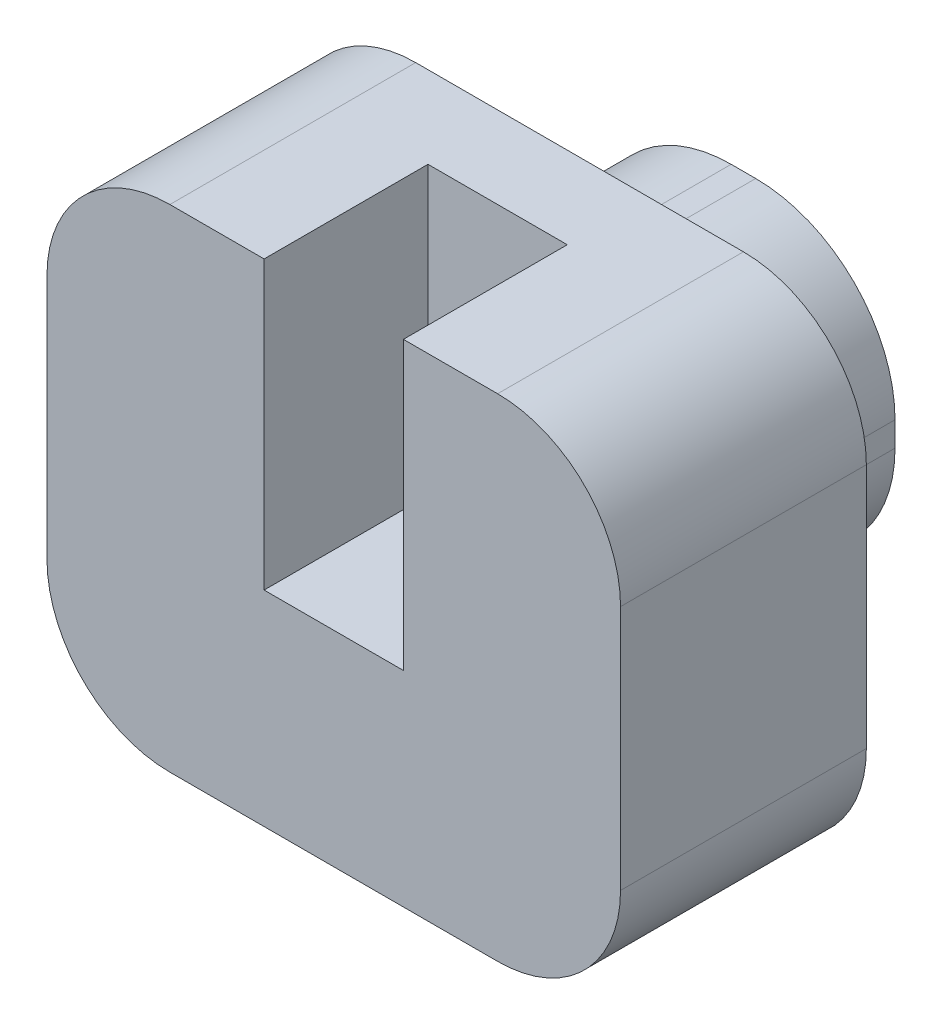
ISO-10303-21;
HEADER;
FILE_DESCRIPTION(('STEP AP214'),'2;1');
FILE_NAME('part.step','',(''),(''),'','','');
FILE_SCHEMA(('AUTOMOTIVE_DESIGN { 1 0 10303 214 1 1 1 1 }'));
ENDSEC;
DATA;
#1=APPLICATION_CONTEXT('core data for automotive mechanical design processes');
#2=APPLICATION_PROTOCOL_DEFINITION('international standard','automotive_design',2000,#1);
#3=PRODUCT_CONTEXT('',#1,'mechanical');
#4=PRODUCT('Part','Part','',(#3));
#5=PRODUCT_RELATED_PRODUCT_CATEGORY('part','',(#4));
#6=PRODUCT_DEFINITION_FORMATION('','',#4);
#7=PRODUCT_DEFINITION_CONTEXT('part definition',#1,'design');
#8=PRODUCT_DEFINITION('design','',#6,#7);
#9=PRODUCT_DEFINITION_SHAPE('','',#8);
#10=(LENGTH_UNIT() NAMED_UNIT(*) SI_UNIT(.MILLI.,.METRE.));
#11=(NAMED_UNIT(*) PLANE_ANGLE_UNIT() SI_UNIT($,.RADIAN.));
#12=(NAMED_UNIT(*) SI_UNIT($,.STERADIAN.) SOLID_ANGLE_UNIT());
#13=UNCERTAINTY_MEASURE_WITH_UNIT(LENGTH_MEASURE(1.E-05),#10,'distance_accuracy_value','');
#14=(GEOMETRIC_REPRESENTATION_CONTEXT(3) GLOBAL_UNCERTAINTY_ASSIGNED_CONTEXT((#13)) GLOBAL_UNIT_ASSIGNED_CONTEXT((#10,
#11,#12)) REPRESENTATION_CONTEXT('',''));
#15=CARTESIAN_POINT('',(0.,0.,0.));
#16=DIRECTION('',(0.,0.,1.));
#17=DIRECTION('',(1.,0.,0.));
#18=AXIS2_PLACEMENT_3D('',#15,#16,#17);
#19=CARTESIAN_POINT('',(-0.15,-0.15,2.));
#20=DIRECTION('',(0.,0.,-1.));
#21=DIRECTION('',(-1.,0.,0.));
#22=AXIS2_PLACEMENT_3D('',#19,#20,#21);
#23=CYLINDRICAL_SURFACE('',#22,1.7);
#24=CARTESIAN_POINT('',(-0.15,-0.15,0.));
#25=DIRECTION('',(0.,0.,1.));
#26=DIRECTION('',(1.,0.,0.));
#27=AXIS2_PLACEMENT_3D('',#24,#25,#26);
#28=CIRCLE('',#27,1.7);
#29=CARTESIAN_POINT('',(-1.85,-0.15,0.));
#30=VERTEX_POINT('',#29);
#31=CARTESIAN_POINT('',(-0.15,-1.85,0.));
#32=VERTEX_POINT('',#31);
#33=EDGE_CURVE('E151',#30,#32,#28,.T.);
#34=ORIENTED_EDGE('',*,*,#33,.T.);
#35=DIRECTION('',(0.,0.,-1.));
#36=VECTOR('',#35,1.);
#37=CARTESIAN_POINT('',(-0.15,-1.85,2.));
#38=LINE('',#37,#36);
#39=CARTESIAN_POINT('',(-0.15,-1.85,2.));
#40=VERTEX_POINT('',#39);
#41=EDGE_CURVE('E11',#40,#32,#38,.T.);
#42=ORIENTED_EDGE('',*,*,#41,.F.);
#43=CARTESIAN_POINT('',(-0.15,-0.15,2.));
#44=DIRECTION('',(0.,0.,1.));
#45=DIRECTION('',(1.,0.,0.));
#46=AXIS2_PLACEMENT_3D('',#43,#44,#45);
#47=CIRCLE('',#46,1.7);
#48=CARTESIAN_POINT('',(-1.85,-0.15,2.));
#49=VERTEX_POINT('',#48);
#50=EDGE_CURVE('E167',#49,#40,#47,.T.);
#51=ORIENTED_EDGE('',*,*,#50,.F.);
#52=DIRECTION('',(0.,0.,-1.));
#53=VECTOR('',#52,1.);
#54=CARTESIAN_POINT('',(-1.85,-0.15,2.));
#55=LINE('',#54,#53);
#56=EDGE_CURVE('E150',#49,#30,#55,.T.);
#57=ORIENTED_EDGE('',*,*,#56,.T.);
#58=EDGE_LOOP('',(#34,#42,#51,#57));
#59=FACE_BOUND('',#58,.T.);
#60=ADVANCED_FACE('F36',(#59),#23,.T.);
#61=CARTESIAN_POINT('',(-0.15,-1.85,2.));
#62=DIRECTION('',(0.,1.,0.));
#63=DIRECTION('',(0.,0.,1.));
#64=AXIS2_PLACEMENT_3D('',#61,#62,#63);
#65=PLANE('',#64);
#66=DIRECTION('',(1.,0.,0.));
#67=VECTOR('',#66,1.);
#68=CARTESIAN_POINT('',(-0.15,-1.85,0.));
#69=LINE('',#68,#67);
#70=CARTESIAN_POINT('',(0.150000000000001,-1.85,0.));
#71=VERTEX_POINT('',#70);
#72=EDGE_CURVE('E154',#32,#71,#69,.T.);
#73=ORIENTED_EDGE('',*,*,#72,.T.);
#74=DIRECTION('',(0.,0.,-1.));
#75=VECTOR('',#74,1.);
#76=CARTESIAN_POINT('',(0.150000000000001,-1.85,2.));
#77=LINE('',#76,#75);
#78=CARTESIAN_POINT('',(0.150000000000001,-1.85,2.));
#79=VERTEX_POINT('',#78);
#80=EDGE_CURVE('E43',#79,#71,#77,.T.);
#81=ORIENTED_EDGE('',*,*,#80,.F.);
#82=DIRECTION('',(1.,0.,0.));
#83=VECTOR('',#82,1.);
#84=CARTESIAN_POINT('',(-0.15,-1.85,2.));
#85=LINE('',#84,#83);
#86=EDGE_CURVE('E100',#40,#79,#85,.T.);
#87=ORIENTED_EDGE('',*,*,#86,.F.);
#88=ORIENTED_EDGE('',*,*,#41,.T.);
#89=EDGE_LOOP('',(#73,#81,#87,#88));
#90=FACE_BOUND('',#89,.T.);
#91=ADVANCED_FACE('F404',(#90),#65,.F.);
#92=CARTESIAN_POINT('',(0.15,-0.15,2.));
#93=DIRECTION('',(0.,0.,-1.));
#94=DIRECTION('',(-1.,0.,0.));
#95=AXIS2_PLACEMENT_3D('',#92,#93,#94);
#96=CYLINDRICAL_SURFACE('',#95,1.7);
#97=CARTESIAN_POINT('',(0.15,-0.15,0.));
#98=DIRECTION('',(0.,0.,1.));
#99=DIRECTION('',(-1.,0.,0.));
#100=AXIS2_PLACEMENT_3D('',#97,#98,#99);
#101=CIRCLE('',#100,1.7);
#102=CARTESIAN_POINT('',(1.85,-0.15,0.));
#103=VERTEX_POINT('',#102);
#104=EDGE_CURVE('E157',#71,#103,#101,.T.);
#105=ORIENTED_EDGE('',*,*,#104,.T.);
#106=DIRECTION('',(0.,0.,-1.));
#107=VECTOR('',#106,1.);
#108=CARTESIAN_POINT('',(1.85,-0.15,2.));
#109=LINE('',#108,#107);
#110=CARTESIAN_POINT('',(1.85,-0.15,2.));
#111=VERTEX_POINT('',#110);
#112=EDGE_CURVE('E172',#111,#103,#109,.T.);
#113=ORIENTED_EDGE('',*,*,#112,.F.);
#114=CARTESIAN_POINT('',(0.15,-0.15,2.));
#115=DIRECTION('',(0.,0.,1.));
#116=DIRECTION('',(-1.,0.,0.));
#117=AXIS2_PLACEMENT_3D('',#114,#115,#116);
#118=CIRCLE('',#117,1.7);
#119=EDGE_CURVE('E143',#79,#111,#118,.T.);
#120=ORIENTED_EDGE('',*,*,#119,.F.);
#121=ORIENTED_EDGE('',*,*,#80,.T.);
#122=EDGE_LOOP('',(#105,#113,#120,#121));
#123=FACE_BOUND('',#122,.T.);
#124=ADVANCED_FACE('F178',(#123),#96,.T.);
#125=CARTESIAN_POINT('',(1.85,-0.15,2.));
#126=DIRECTION('',(-1.,0.,0.));
#127=DIRECTION('',(0.,0.,1.));
#128=AXIS2_PLACEMENT_3D('',#125,#126,#127);
#129=PLANE('',#128);
#130=DIRECTION('',(0.,1.,0.));
#131=VECTOR('',#130,1.);
#132=CARTESIAN_POINT('',(1.85,-0.15,0.));
#133=LINE('',#132,#131);
#134=CARTESIAN_POINT('',(1.85,0.150000000000001,0.));
#135=VERTEX_POINT('',#134);
#136=EDGE_CURVE('E159',#103,#135,#133,.T.);
#137=ORIENTED_EDGE('',*,*,#136,.T.);
#138=DIRECTION('',(0.,0.,-1.));
#139=VECTOR('',#138,1.);
#140=CARTESIAN_POINT('',(1.85,0.150000000000001,2.));
#141=LINE('',#140,#139);
#142=CARTESIAN_POINT('',(1.85,0.150000000000001,2.));
#143=VERTEX_POINT('',#142);
#144=EDGE_CURVE('E126',#143,#135,#141,.T.);
#145=ORIENTED_EDGE('',*,*,#144,.F.);
#146=DIRECTION('',(0.,1.,0.));
#147=VECTOR('',#146,1.);
#148=CARTESIAN_POINT('',(1.85,-0.15,2.));
#149=LINE('',#148,#147);
#150=EDGE_CURVE('E141',#111,#143,#149,.T.);
#151=ORIENTED_EDGE('',*,*,#150,.F.);
#152=ORIENTED_EDGE('',*,*,#112,.T.);
#153=EDGE_LOOP('',(#137,#145,#151,#152));
#154=FACE_BOUND('',#153,.T.);
#155=ADVANCED_FACE('F184',(#154),#129,.F.);
#156=CARTESIAN_POINT('',(0.15,0.150000000000001,2.));
#157=DIRECTION('',(0.,0.,-1.));
#158=DIRECTION('',(-1.,0.,0.));
#159=AXIS2_PLACEMENT_3D('',#156,#157,#158);
#160=CYLINDRICAL_SURFACE('',#159,1.7);
#161=CARTESIAN_POINT('',(0.15,0.150000000000001,0.));
#162=DIRECTION('',(0.,0.,1.));
#163=DIRECTION('',(1.,0.,0.));
#164=AXIS2_PLACEMENT_3D('',#161,#162,#163);
#165=CIRCLE('',#164,1.7);
#166=CARTESIAN_POINT('',(0.15,1.85,0.));
#167=VERTEX_POINT('',#166);
#168=EDGE_CURVE('E123',#135,#167,#165,.T.);
#169=ORIENTED_EDGE('',*,*,#168,.T.);
#170=DIRECTION('',(0.,0.,-1.));
#171=VECTOR('',#170,1.);
#172=CARTESIAN_POINT('',(0.15,1.85,2.));
#173=LINE('',#172,#171);
#174=CARTESIAN_POINT('',(0.15,1.85,2.));
#175=VERTEX_POINT('',#174);
#176=EDGE_CURVE('E115',#175,#167,#173,.T.);
#177=ORIENTED_EDGE('',*,*,#176,.F.);
#178=CARTESIAN_POINT('',(0.15,0.150000000000001,2.));
#179=DIRECTION('',(0.,0.,1.));
#180=DIRECTION('',(1.,0.,0.));
#181=AXIS2_PLACEMENT_3D('',#178,#179,#180);
#182=CIRCLE('',#181,1.7);
#183=EDGE_CURVE('E120',#143,#175,#182,.T.);
#184=ORIENTED_EDGE('',*,*,#183,.F.);
#185=ORIENTED_EDGE('',*,*,#144,.T.);
#186=EDGE_LOOP('',(#169,#177,#184,#185));
#187=FACE_BOUND('',#186,.T.);
#188=ADVANCED_FACE('F117',(#187),#160,.T.);
#189=CARTESIAN_POINT('',(-0.15,1.85,2.));
#190=DIRECTION('',(0.,-1.,0.));
#191=DIRECTION('',(0.,0.,-1.));
#192=AXIS2_PLACEMENT_3D('',#189,#190,#191);
#193=PLANE('',#192);
#194=DIRECTION('',(-1.,0.,0.));
#195=VECTOR('',#194,1.);
#196=CARTESIAN_POINT('',(-0.15,1.85,0.));
#197=LINE('',#196,#195);
#198=CARTESIAN_POINT('',(-0.15,1.85,0.));
#199=VERTEX_POINT('',#198);
#200=EDGE_CURVE('E162',#167,#199,#197,.T.);
#201=ORIENTED_EDGE('',*,*,#200,.T.);
#202=DIRECTION('',(0.,0.,-1.));
#203=VECTOR('',#202,1.);
#204=CARTESIAN_POINT('',(-0.15,1.85,2.));
#205=LINE('',#204,#203);
#206=CARTESIAN_POINT('',(-0.15,1.85,2.));
#207=VERTEX_POINT('',#206);
#208=EDGE_CURVE('E127',#207,#199,#205,.T.);
#209=ORIENTED_EDGE('',*,*,#208,.F.);
#210=DIRECTION('',(-1.,0.,0.));
#211=VECTOR('',#210,1.);
#212=CARTESIAN_POINT('',(-0.15,1.85,2.));
#213=LINE('',#212,#211);
#214=EDGE_CURVE('E130',#175,#207,#213,.T.);
#215=ORIENTED_EDGE('',*,*,#214,.F.);
#216=ORIENTED_EDGE('',*,*,#176,.T.);
#217=EDGE_LOOP('',(#201,#209,#215,#216));
#218=FACE_BOUND('',#217,.T.);
#219=ADVANCED_FACE('F131',(#218),#193,.F.);
#220=CARTESIAN_POINT('',(-0.15,0.150000000000001,2.));
#221=DIRECTION('',(0.,0.,-1.));
#222=DIRECTION('',(-1.,0.,0.));
#223=AXIS2_PLACEMENT_3D('',#220,#221,#222);
#224=CYLINDRICAL_SURFACE('',#223,1.7);
#225=CARTESIAN_POINT('',(-0.15,0.150000000000001,0.));
#226=DIRECTION('',(0.,0.,1.));
#227=DIRECTION('',(1.,0.,0.));
#228=AXIS2_PLACEMENT_3D('',#225,#226,#227);
#229=CIRCLE('',#228,1.7);
#230=CARTESIAN_POINT('',(-1.85,0.150000000000001,0.));
#231=VERTEX_POINT('',#230);
#232=EDGE_CURVE('E164',#199,#231,#229,.T.);
#233=ORIENTED_EDGE('',*,*,#232,.T.);
#234=DIRECTION('',(0.,0.,-1.));
#235=VECTOR('',#234,1.);
#236=CARTESIAN_POINT('',(-1.85,0.150000000000001,2.));
#237=LINE('',#236,#235);
#238=CARTESIAN_POINT('',(-1.85,0.150000000000001,2.));
#239=VERTEX_POINT('',#238);
#240=EDGE_CURVE('E59',#239,#231,#237,.T.);
#241=ORIENTED_EDGE('',*,*,#240,.F.);
#242=CARTESIAN_POINT('',(-0.15,0.150000000000001,2.));
#243=DIRECTION('',(0.,0.,1.));
#244=DIRECTION('',(1.,0.,0.));
#245=AXIS2_PLACEMENT_3D('',#242,#243,#244);
#246=CIRCLE('',#245,1.7);
#247=EDGE_CURVE('E135',#207,#239,#246,.T.);
#248=ORIENTED_EDGE('',*,*,#247,.F.);
#249=ORIENTED_EDGE('',*,*,#208,.T.);
#250=EDGE_LOOP('',(#233,#241,#248,#249));
#251=FACE_BOUND('',#250,.T.);
#252=ADVANCED_FACE('F411',(#251),#224,.T.);
#253=CARTESIAN_POINT('',(-1.85,-0.15,2.));
#254=DIRECTION('',(1.,0.,0.));
#255=DIRECTION('',(0.,0.,-1.));
#256=AXIS2_PLACEMENT_3D('',#253,#254,#255);
#257=PLANE('',#256);
#258=DIRECTION('',(0.,-1.,0.));
#259=VECTOR('',#258,1.);
#260=CARTESIAN_POINT('',(-1.85,-0.15,0.));
#261=LINE('',#260,#259);
#262=EDGE_CURVE('E92',#231,#30,#261,.T.);
#263=ORIENTED_EDGE('',*,*,#262,.T.);
#264=ORIENTED_EDGE('',*,*,#56,.F.);
#265=DIRECTION('',(0.,-1.,0.));
#266=VECTOR('',#265,1.);
#267=CARTESIAN_POINT('',(-1.85,-0.15,2.));
#268=LINE('',#267,#266);
#269=EDGE_CURVE('E148',#239,#49,#268,.T.);
#270=ORIENTED_EDGE('',*,*,#269,.F.);
#271=ORIENTED_EDGE('',*,*,#240,.T.);
#272=EDGE_LOOP('',(#263,#264,#270,#271));
#273=FACE_BOUND('',#272,.T.);
#274=ADVANCED_FACE('F412',(#273),#257,.F.);
#275=CARTESIAN_POINT('',(-0.15,-0.15,0.));
#276=DIRECTION('',(0.,0.,1.));
#277=DIRECTION('',(1.,0.,0.));
#278=AXIS2_PLACEMENT_3D('',#275,#276,#277);
#279=PLANE('',#278);
#280=ORIENTED_EDGE('',*,*,#33,.F.);
#281=ORIENTED_EDGE('',*,*,#262,.F.);
#282=ORIENTED_EDGE('',*,*,#232,.F.);
#283=ORIENTED_EDGE('',*,*,#200,.F.);
#284=ORIENTED_EDGE('',*,*,#168,.F.);
#285=ORIENTED_EDGE('',*,*,#136,.F.);
#286=ORIENTED_EDGE('',*,*,#104,.F.);
#287=ORIENTED_EDGE('',*,*,#72,.F.);
#288=EDGE_LOOP('',(#280,#281,#282,#283,#284,#285,#286,#287));
#289=FACE_BOUND('',#288,.T.);
#290=ADVANCED_FACE('F182',(#289),#279,.F.);
#291=CARTESIAN_POINT('',(2.,1.5,2.));
#292=DIRECTION('',(0.,0.,1.));
#293=DIRECTION('',(1.,0.,0.));
#294=AXIS2_PLACEMENT_3D('',#291,#292,#293);
#295=PLANE('',#294);
#296=DIRECTION('',(1.,0.,0.));
#297=VECTOR('',#296,1.);
#298=CARTESIAN_POINT('',(-2.,3.,2.));
#299=LINE('',#298,#297);
#300=CARTESIAN_POINT('',(-2.,3.,2.));
#301=VERTEX_POINT('',#300);
#302=CARTESIAN_POINT('',(2.,3.,2.));
#303=VERTEX_POINT('',#302);
#304=EDGE_CURVE('E235',#301,#303,#299,.T.);
#305=ORIENTED_EDGE('',*,*,#304,.T.);
#306=CARTESIAN_POINT('',(2.,1.5,2.));
#307=DIRECTION('',(0.,0.,1.));
#308=DIRECTION('',(1.,0.,0.));
#309=AXIS2_PLACEMENT_3D('',#306,#307,#308);
#310=CIRCLE('',#309,1.5);
#311=CARTESIAN_POINT('',(3.5,1.5,2.));
#312=VERTEX_POINT('',#311);
#313=EDGE_CURVE('E232',#312,#303,#310,.T.);
#314=ORIENTED_EDGE('',*,*,#313,.F.);
#315=DIRECTION('',(0.,1.,0.));
#316=VECTOR('',#315,1.);
#317=CARTESIAN_POINT('',(3.5,-1.5,2.));
#318=LINE('',#317,#316);
#319=CARTESIAN_POINT('',(3.5,-1.5,2.));
#320=VERTEX_POINT('',#319);
#321=EDGE_CURVE('E229',#320,#312,#318,.T.);
#322=ORIENTED_EDGE('',*,*,#321,.F.);
#323=CARTESIAN_POINT('',(2.,-1.5,2.));
#324=DIRECTION('',(0.,0.,1.));
#325=DIRECTION('',(1.,0.,0.));
#326=AXIS2_PLACEMENT_3D('',#323,#324,#325);
#327=CIRCLE('',#326,1.5);
#328=CARTESIAN_POINT('',(2.,-3.,2.));
#329=VERTEX_POINT('',#328);
#330=EDGE_CURVE('E226',#329,#320,#327,.T.);
#331=ORIENTED_EDGE('',*,*,#330,.F.);
#332=DIRECTION('',(1.,0.,0.));
#333=VECTOR('',#332,1.);
#334=CARTESIAN_POINT('',(-2.,-3.,2.));
#335=LINE('',#334,#333);
#336=CARTESIAN_POINT('',(-2.,-3.,2.));
#337=VERTEX_POINT('',#336);
#338=EDGE_CURVE('E223',#337,#329,#335,.T.);
#339=ORIENTED_EDGE('',*,*,#338,.F.);
#340=CARTESIAN_POINT('',(-2.,-1.5,2.));
#341=DIRECTION('',(0.,0.,-1.));
#342=DIRECTION('',(-1.,0.,0.));
#343=AXIS2_PLACEMENT_3D('',#340,#341,#342);
#344=CIRCLE('',#343,1.5);
#345=CARTESIAN_POINT('',(-3.5,-1.5,2.));
#346=VERTEX_POINT('',#345);
#347=EDGE_CURVE('E220',#337,#346,#344,.T.);
#348=ORIENTED_EDGE('',*,*,#347,.T.);
#349=DIRECTION('',(0.,1.,0.));
#350=VECTOR('',#349,1.);
#351=CARTESIAN_POINT('',(-3.5,-1.5,2.));
#352=LINE('',#351,#350);
#353=CARTESIAN_POINT('',(-3.5,1.5,2.));
#354=VERTEX_POINT('',#353);
#355=EDGE_CURVE('E217',#346,#354,#352,.T.);
#356=ORIENTED_EDGE('',*,*,#355,.T.);
#357=CARTESIAN_POINT('',(-2.,1.5,2.));
#358=DIRECTION('',(0.,0.,-1.));
#359=DIRECTION('',(-1.,0.,0.));
#360=AXIS2_PLACEMENT_3D('',#357,#358,#359);
#361=CIRCLE('',#360,1.5);
#362=EDGE_CURVE('E213',#354,#301,#361,.T.);
#363=ORIENTED_EDGE('',*,*,#362,.T.);
#364=EDGE_LOOP('',(#305,#314,#322,#331,#339,#348,#356,#363));
#365=FACE_BOUND('',#364,.T.);
#366=ORIENTED_EDGE('',*,*,#269,.T.);
#367=ORIENTED_EDGE('',*,*,#50,.T.);
#368=ORIENTED_EDGE('',*,*,#86,.T.);
#369=ORIENTED_EDGE('',*,*,#119,.T.);
#370=ORIENTED_EDGE('',*,*,#150,.T.);
#371=ORIENTED_EDGE('',*,*,#183,.T.);
#372=ORIENTED_EDGE('',*,*,#214,.T.);
#373=ORIENTED_EDGE('',*,*,#247,.T.);
#374=EDGE_LOOP('',(#366,#367,#368,#369,#370,#371,#372,#373));
#375=FACE_BOUND('',#374,.T.);
#376=ADVANCED_FACE('F138',(#365,#375),#295,.F.);
#377=CARTESIAN_POINT('',(-2.,3.,5.));
#378=DIRECTION('',(0.,1.,0.));
#379=DIRECTION('',(0.,0.,1.));
#380=AXIS2_PLACEMENT_3D('',#377,#378,#379);
#381=PLANE('',#380);
#382=DIRECTION('',(0.,0.,-1.));
#383=VECTOR('',#382,1.);
#384=CARTESIAN_POINT('',(0.850000000000001,3.,5.));
#385=LINE('',#384,#383);
#386=CARTESIAN_POINT('',(0.850000000000001,3.,5.));
#387=VERTEX_POINT('',#386);
#388=CARTESIAN_POINT('',(0.850000000000001,3.,3.));
#389=VERTEX_POINT('',#388);
#390=EDGE_CURVE('E281',#387,#389,#385,.T.);
#391=ORIENTED_EDGE('',*,*,#390,.F.);
#392=DIRECTION('',(1.,0.,0.));
#393=VECTOR('',#392,1.);
#394=CARTESIAN_POINT('',(-2.,3.,5.));
#395=LINE('',#394,#393);
#396=CARTESIAN_POINT('',(2.,3.,5.));
#397=VERTEX_POINT('',#396);
#398=EDGE_CURVE('E216',#387,#397,#395,.T.);
#399=ORIENTED_EDGE('',*,*,#398,.T.);
#400=DIRECTION('',(0.,0.,-1.));
#401=VECTOR('',#400,1.);
#402=CARTESIAN_POINT('',(2.,3.,5.));
#403=LINE('',#402,#401);
#404=EDGE_CURVE('E189',#397,#303,#403,.T.);
#405=ORIENTED_EDGE('',*,*,#404,.T.);
#406=ORIENTED_EDGE('',*,*,#304,.F.);
#407=DIRECTION('',(0.,0.,-1.));
#408=VECTOR('',#407,1.);
#409=CARTESIAN_POINT('',(-2.,3.,5.));
#410=LINE('',#409,#408);
#411=CARTESIAN_POINT('',(-2.,3.,5.));
#412=VERTEX_POINT('',#411);
#413=EDGE_CURVE('E155',#412,#301,#410,.T.);
#414=ORIENTED_EDGE('',*,*,#413,.F.);
#415=CARTESIAN_POINT('',(-0.849999999999999,3.,5.));
#416=VERTEX_POINT('',#415);
#417=EDGE_CURVE('E259',#412,#416,#395,.T.);
#418=ORIENTED_EDGE('',*,*,#417,.T.);
#419=DIRECTION('',(0.,0.,1.));
#420=VECTOR('',#419,1.);
#421=CARTESIAN_POINT('',(-0.849999999999999,3.,5.));
#422=LINE('',#421,#420);
#423=CARTESIAN_POINT('',(-0.849999999999999,3.,3.));
#424=VERTEX_POINT('',#423);
#425=EDGE_CURVE('E274',#424,#416,#422,.T.);
#426=ORIENTED_EDGE('',*,*,#425,.F.);
#427=DIRECTION('',(-1.,0.,0.));
#428=VECTOR('',#427,1.);
#429=CARTESIAN_POINT('',(-0.849999999999999,3.,3.));
#430=LINE('',#429,#428);
#431=EDGE_CURVE('E278',#389,#424,#430,.T.);
#432=ORIENTED_EDGE('',*,*,#431,.F.);
#433=EDGE_LOOP('',(#391,#399,#405,#406,#414,#418,#426,#432));
#434=FACE_BOUND('',#433,.T.);
#435=ADVANCED_FACE('F356',(#434),#381,.T.);
#436=CARTESIAN_POINT('',(-2.,1.5,5.));
#437=DIRECTION('',(0.,0.,-1.));
#438=DIRECTION('',(-1.,0.,0.));
#439=AXIS2_PLACEMENT_3D('',#436,#437,#438);
#440=CYLINDRICAL_SURFACE('',#439,1.5);
#441=ORIENTED_EDGE('',*,*,#362,.F.);
#442=DIRECTION('',(0.,0.,-1.));
#443=VECTOR('',#442,1.);
#444=CARTESIAN_POINT('',(-3.5,1.5,5.));
#445=LINE('',#444,#443);
#446=CARTESIAN_POINT('',(-3.5,1.5,5.));
#447=VERTEX_POINT('',#446);
#448=EDGE_CURVE('E208',#447,#354,#445,.T.);
#449=ORIENTED_EDGE('',*,*,#448,.F.);
#450=CARTESIAN_POINT('',(-2.,1.5,5.));
#451=DIRECTION('',(0.,0.,-1.));
#452=DIRECTION('',(-1.,0.,0.));
#453=AXIS2_PLACEMENT_3D('',#450,#451,#452);
#454=CIRCLE('',#453,1.5);
#455=EDGE_CURVE('E193',#447,#412,#454,.T.);
#456=ORIENTED_EDGE('',*,*,#455,.T.);
#457=ORIENTED_EDGE('',*,*,#413,.T.);
#458=EDGE_LOOP('',(#441,#449,#456,#457));
#459=FACE_BOUND('',#458,.T.);
#460=ADVANCED_FACE('F352',(#459),#440,.T.);
#461=CARTESIAN_POINT('',(-3.5,-1.5,5.));
#462=DIRECTION('',(-1.,0.,0.));
#463=DIRECTION('',(0.,0.,1.));
#464=AXIS2_PLACEMENT_3D('',#461,#462,#463);
#465=PLANE('',#464);
#466=ORIENTED_EDGE('',*,*,#355,.F.);
#467=DIRECTION('',(0.,0.,-1.));
#468=VECTOR('',#467,1.);
#469=CARTESIAN_POINT('',(-3.5,-1.5,5.));
#470=LINE('',#469,#468);
#471=CARTESIAN_POINT('',(-3.5,-1.5,5.));
#472=VERTEX_POINT('',#471);
#473=EDGE_CURVE('E205',#472,#346,#470,.T.);
#474=ORIENTED_EDGE('',*,*,#473,.F.);
#475=DIRECTION('',(0.,1.,0.));
#476=VECTOR('',#475,1.);
#477=CARTESIAN_POINT('',(-3.5,-1.5,5.));
#478=LINE('',#477,#476);
#479=EDGE_CURVE('E241',#472,#447,#478,.T.);
#480=ORIENTED_EDGE('',*,*,#479,.T.);
#481=ORIENTED_EDGE('',*,*,#448,.T.);
#482=EDGE_LOOP('',(#466,#474,#480,#481));
#483=FACE_BOUND('',#482,.T.);
#484=ADVANCED_FACE('F364',(#483),#465,.T.);
#485=CARTESIAN_POINT('',(-2.,-1.5,5.));
#486=DIRECTION('',(0.,0.,-1.));
#487=DIRECTION('',(-1.,0.,0.));
#488=AXIS2_PLACEMENT_3D('',#485,#486,#487);
#489=CYLINDRICAL_SURFACE('',#488,1.5);
#490=ORIENTED_EDGE('',*,*,#347,.F.);
#491=DIRECTION('',(0.,0.,-1.));
#492=VECTOR('',#491,1.);
#493=CARTESIAN_POINT('',(-2.,-3.,5.));
#494=LINE('',#493,#492);
#495=CARTESIAN_POINT('',(-2.,-3.,5.));
#496=VERTEX_POINT('',#495);
#497=EDGE_CURVE('E202',#496,#337,#494,.T.);
#498=ORIENTED_EDGE('',*,*,#497,.F.);
#499=CARTESIAN_POINT('',(-2.,-1.5,5.));
#500=DIRECTION('',(0.,0.,-1.));
#501=DIRECTION('',(-1.,0.,0.));
#502=AXIS2_PLACEMENT_3D('',#499,#500,#501);
#503=CIRCLE('',#502,1.5);
#504=EDGE_CURVE('E244',#496,#472,#503,.T.);
#505=ORIENTED_EDGE('',*,*,#504,.T.);
#506=ORIENTED_EDGE('',*,*,#473,.T.);
#507=EDGE_LOOP('',(#490,#498,#505,#506));
#508=FACE_BOUND('',#507,.T.);
#509=ADVANCED_FACE('F394',(#508),#489,.T.);
#510=CARTESIAN_POINT('',(-2.,-3.,5.));
#511=DIRECTION('',(0.,1.,0.));
#512=DIRECTION('',(0.,0.,1.));
#513=AXIS2_PLACEMENT_3D('',#510,#511,#512);
#514=PLANE('',#513);
#515=ORIENTED_EDGE('',*,*,#338,.T.);
#516=DIRECTION('',(0.,0.,-1.));
#517=VECTOR('',#516,1.);
#518=CARTESIAN_POINT('',(2.,-3.,5.));
#519=LINE('',#518,#517);
#520=CARTESIAN_POINT('',(2.,-3.,5.));
#521=VERTEX_POINT('',#520);
#522=EDGE_CURVE('E199',#521,#329,#519,.T.);
#523=ORIENTED_EDGE('',*,*,#522,.F.);
#524=DIRECTION('',(1.,0.,0.));
#525=VECTOR('',#524,1.);
#526=CARTESIAN_POINT('',(-2.,-3.,5.));
#527=LINE('',#526,#525);
#528=EDGE_CURVE('E247',#496,#521,#527,.T.);
#529=ORIENTED_EDGE('',*,*,#528,.F.);
#530=ORIENTED_EDGE('',*,*,#497,.T.);
#531=EDGE_LOOP('',(#515,#523,#529,#530));
#532=FACE_BOUND('',#531,.T.);
#533=ADVANCED_FACE('F392',(#532),#514,.F.);
#534=CARTESIAN_POINT('',(2.,-1.5,5.));
#535=DIRECTION('',(0.,0.,-1.));
#536=DIRECTION('',(-1.,0.,0.));
#537=AXIS2_PLACEMENT_3D('',#534,#535,#536);
#538=CYLINDRICAL_SURFACE('',#537,1.5);
#539=ORIENTED_EDGE('',*,*,#330,.T.);
#540=DIRECTION('',(0.,0.,-1.));
#541=VECTOR('',#540,1.);
#542=CARTESIAN_POINT('',(3.5,-1.5,5.));
#543=LINE('',#542,#541);
#544=CARTESIAN_POINT('',(3.5,-1.5,5.));
#545=VERTEX_POINT('',#544);
#546=EDGE_CURVE('E196',#545,#320,#543,.T.);
#547=ORIENTED_EDGE('',*,*,#546,.F.);
#548=CARTESIAN_POINT('',(2.,-1.5,5.));
#549=DIRECTION('',(0.,0.,1.));
#550=DIRECTION('',(1.,0.,0.));
#551=AXIS2_PLACEMENT_3D('',#548,#549,#550);
#552=CIRCLE('',#551,1.5);
#553=EDGE_CURVE('E250',#521,#545,#552,.T.);
#554=ORIENTED_EDGE('',*,*,#553,.F.);
#555=ORIENTED_EDGE('',*,*,#522,.T.);
#556=EDGE_LOOP('',(#539,#547,#554,#555));
#557=FACE_BOUND('',#556,.T.);
#558=ADVANCED_FACE('F388',(#557),#538,.T.);
#559=CARTESIAN_POINT('',(3.5,-1.5,5.));
#560=DIRECTION('',(-1.,0.,0.));
#561=DIRECTION('',(0.,-1.,0.));
#562=AXIS2_PLACEMENT_3D('',#559,#560,#561);
#563=PLANE('',#562);
#564=ORIENTED_EDGE('',*,*,#321,.T.);
#565=DIRECTION('',(0.,0.,-1.));
#566=VECTOR('',#565,1.);
#567=CARTESIAN_POINT('',(3.5,1.5,5.));
#568=LINE('',#567,#566);
#569=CARTESIAN_POINT('',(3.5,1.5,5.));
#570=VERTEX_POINT('',#569);
#571=EDGE_CURVE('E192',#570,#312,#568,.T.);
#572=ORIENTED_EDGE('',*,*,#571,.F.);
#573=DIRECTION('',(0.,1.,0.));
#574=VECTOR('',#573,1.);
#575=CARTESIAN_POINT('',(3.5,-1.5,5.));
#576=LINE('',#575,#574);
#577=EDGE_CURVE('E253',#545,#570,#576,.T.);
#578=ORIENTED_EDGE('',*,*,#577,.F.);
#579=ORIENTED_EDGE('',*,*,#546,.T.);
#580=EDGE_LOOP('',(#564,#572,#578,#579));
#581=FACE_BOUND('',#580,.T.);
#582=ADVANCED_FACE('F384',(#581),#563,.F.);
#583=CARTESIAN_POINT('',(2.,1.5,5.));
#584=DIRECTION('',(0.,0.,-1.));
#585=DIRECTION('',(-1.,0.,0.));
#586=AXIS2_PLACEMENT_3D('',#583,#584,#585);
#587=CYLINDRICAL_SURFACE('',#586,1.5);
#588=ORIENTED_EDGE('',*,*,#313,.T.);
#589=ORIENTED_EDGE('',*,*,#404,.F.);
#590=CARTESIAN_POINT('',(2.,1.5,5.));
#591=DIRECTION('',(0.,0.,1.));
#592=DIRECTION('',(1.,0.,0.));
#593=AXIS2_PLACEMENT_3D('',#590,#591,#592);
#594=CIRCLE('',#593,1.5);
#595=EDGE_CURVE('E256',#570,#397,#594,.T.);
#596=ORIENTED_EDGE('',*,*,#595,.F.);
#597=ORIENTED_EDGE('',*,*,#571,.T.);
#598=EDGE_LOOP('',(#588,#589,#596,#597));
#599=FACE_BOUND('',#598,.T.);
#600=ADVANCED_FACE('F380',(#599),#587,.T.);
#601=CARTESIAN_POINT('',(2.,1.5,5.));
#602=DIRECTION('',(0.,0.,1.));
#603=DIRECTION('',(1.,0.,0.));
#604=AXIS2_PLACEMENT_3D('',#601,#602,#603);
#605=PLANE('',#604);
#606=DIRECTION('',(0.,1.,0.));
#607=VECTOR('',#606,1.);
#608=CARTESIAN_POINT('',(0.850000000000001,-0.500000000000001,5.));
#609=LINE('',#608,#607);
#610=CARTESIAN_POINT('',(0.850000000000001,-0.500000000000001,5.));
#611=VERTEX_POINT('',#610);
#612=EDGE_CURVE('E238',#611,#387,#609,.T.);
#613=ORIENTED_EDGE('',*,*,#612,.F.);
#614=DIRECTION('',(1.,0.,0.));
#615=VECTOR('',#614,1.);
#616=CARTESIAN_POINT('',(-0.849999999999999,-0.500000000000001,5.));
#617=LINE('',#616,#615);
#618=CARTESIAN_POINT('',(-0.849999999999999,-0.500000000000001,5.));
#619=VERTEX_POINT('',#618);
#620=EDGE_CURVE('E266',#619,#611,#617,.T.);
#621=ORIENTED_EDGE('',*,*,#620,.F.);
#622=DIRECTION('',(0.,1.,0.));
#623=VECTOR('',#622,1.);
#624=CARTESIAN_POINT('',(-0.849999999999999,-0.500000000000001,5.));
#625=LINE('',#624,#623);
#626=EDGE_CURVE('E269',#619,#416,#625,.T.);
#627=ORIENTED_EDGE('',*,*,#626,.T.);
#628=ORIENTED_EDGE('',*,*,#417,.F.);
#629=ORIENTED_EDGE('',*,*,#455,.F.);
#630=ORIENTED_EDGE('',*,*,#479,.F.);
#631=ORIENTED_EDGE('',*,*,#504,.F.);
#632=ORIENTED_EDGE('',*,*,#528,.T.);
#633=ORIENTED_EDGE('',*,*,#553,.T.);
#634=ORIENTED_EDGE('',*,*,#577,.T.);
#635=ORIENTED_EDGE('',*,*,#595,.T.);
#636=ORIENTED_EDGE('',*,*,#398,.F.);
#637=EDGE_LOOP('',(#613,#621,#627,#628,#629,#630,#631,#632,#633,#634,#635,#636));
#638=FACE_BOUND('',#637,.T.);
#639=ADVANCED_FACE('F368',(#638),#605,.T.);
#640=CARTESIAN_POINT('',(0.850000000000001,-0.500000000000001,5.));
#641=DIRECTION('',(1.,0.,0.));
#642=DIRECTION('',(0.,0.,-1.));
#643=AXIS2_PLACEMENT_3D('',#640,#641,#642);
#644=PLANE('',#643);
#645=ORIENTED_EDGE('',*,*,#390,.T.);
#646=DIRECTION('',(0.,1.,0.));
#647=VECTOR('',#646,1.);
#648=CARTESIAN_POINT('',(0.850000000000001,-0.500000000000001,3.));
#649=LINE('',#648,#647);
#650=CARTESIAN_POINT('',(0.850000000000001,-0.500000000000001,3.));
#651=VERTEX_POINT('',#650);
#652=EDGE_CURVE('E262',#651,#389,#649,.T.);
#653=ORIENTED_EDGE('',*,*,#652,.F.);
#654=DIRECTION('',(0.,0.,-1.));
#655=VECTOR('',#654,1.);
#656=CARTESIAN_POINT('',(0.850000000000001,-0.500000000000001,5.));
#657=LINE('',#656,#655);
#658=EDGE_CURVE('E277',#611,#651,#657,.T.);
#659=ORIENTED_EDGE('',*,*,#658,.F.);
#660=ORIENTED_EDGE('',*,*,#612,.T.);
#661=EDGE_LOOP('',(#645,#653,#659,#660));
#662=FACE_BOUND('',#661,.T.);
#663=ADVANCED_FACE('F301',(#662),#644,.F.);
#664=CARTESIAN_POINT('',(-0.849999999999999,-0.500000000000001,5.));
#665=DIRECTION('',(-1.,0.,0.));
#666=DIRECTION('',(0.,0.,1.));
#667=AXIS2_PLACEMENT_3D('',#664,#665,#666);
#668=PLANE('',#667);
#669=ORIENTED_EDGE('',*,*,#425,.T.);
#670=ORIENTED_EDGE('',*,*,#626,.F.);
#671=DIRECTION('',(0.,0.,1.));
#672=VECTOR('',#671,1.);
#673=CARTESIAN_POINT('',(-0.849999999999999,-0.500000000000001,5.));
#674=LINE('',#673,#672);
#675=CARTESIAN_POINT('',(-0.849999999999999,-0.500000000000001,3.));
#676=VERTEX_POINT('',#675);
#677=EDGE_CURVE('E50',#676,#619,#674,.T.);
#678=ORIENTED_EDGE('',*,*,#677,.F.);
#679=DIRECTION('',(0.,1.,0.));
#680=VECTOR('',#679,1.);
#681=CARTESIAN_POINT('',(-0.849999999999999,-0.500000000000001,3.));
#682=LINE('',#681,#680);
#683=EDGE_CURVE('E265',#676,#424,#682,.T.);
#684=ORIENTED_EDGE('',*,*,#683,.T.);
#685=EDGE_LOOP('',(#669,#670,#678,#684));
#686=FACE_BOUND('',#685,.T.);
#687=ADVANCED_FACE('F372',(#686),#668,.F.);
#688=CARTESIAN_POINT('',(-0.849999999999999,-0.500000000000001,3.));
#689=DIRECTION('',(0.,0.,-1.));
#690=DIRECTION('',(-1.,0.,0.));
#691=AXIS2_PLACEMENT_3D('',#688,#689,#690);
#692=PLANE('',#691);
#693=ORIENTED_EDGE('',*,*,#431,.T.);
#694=ORIENTED_EDGE('',*,*,#683,.F.);
#695=DIRECTION('',(-1.,0.,0.));
#696=VECTOR('',#695,1.);
#697=CARTESIAN_POINT('',(-0.849999999999999,-0.500000000000001,3.));
#698=LINE('',#697,#696);
#699=EDGE_CURVE('E286',#651,#676,#698,.T.);
#700=ORIENTED_EDGE('',*,*,#699,.F.);
#701=ORIENTED_EDGE('',*,*,#652,.T.);
#702=EDGE_LOOP('',(#693,#694,#700,#701));
#703=FACE_BOUND('',#702,.T.);
#704=ADVANCED_FACE('F374',(#703),#692,.F.);
#705=CARTESIAN_POINT('',(0.,-0.500000000000001,0.));
#706=DIRECTION('',(0.,-1.,0.));
#707=DIRECTION('',(0.,0.,-1.));
#708=AXIS2_PLACEMENT_3D('',#705,#706,#707);
#709=PLANE('',#708);
#710=ORIENTED_EDGE('',*,*,#658,.T.);
#711=ORIENTED_EDGE('',*,*,#699,.T.);
#712=ORIENTED_EDGE('',*,*,#677,.T.);
#713=ORIENTED_EDGE('',*,*,#620,.T.);
#714=EDGE_LOOP('',(#710,#711,#712,#713));
#715=FACE_BOUND('',#714,.T.);
#716=ADVANCED_FACE('F291',(#715),#709,.F.);
#717=CLOSED_SHELL('',(#60,#91,#124,#155,#188,#219,#252,#274,#290,#376,#435,#460,#484,#509,#533,
#558,#582,#600,#639,#663,#687,#704,#716));
#718=MANIFOLD_SOLID_BREP('B2',#717);
#719=ADVANCED_BREP_SHAPE_REPRESENTATION('',(#18,#718),#14);
#720=SHAPE_DEFINITION_REPRESENTATION(#9,#719);
ENDSEC;
END-ISO-10303-21;
